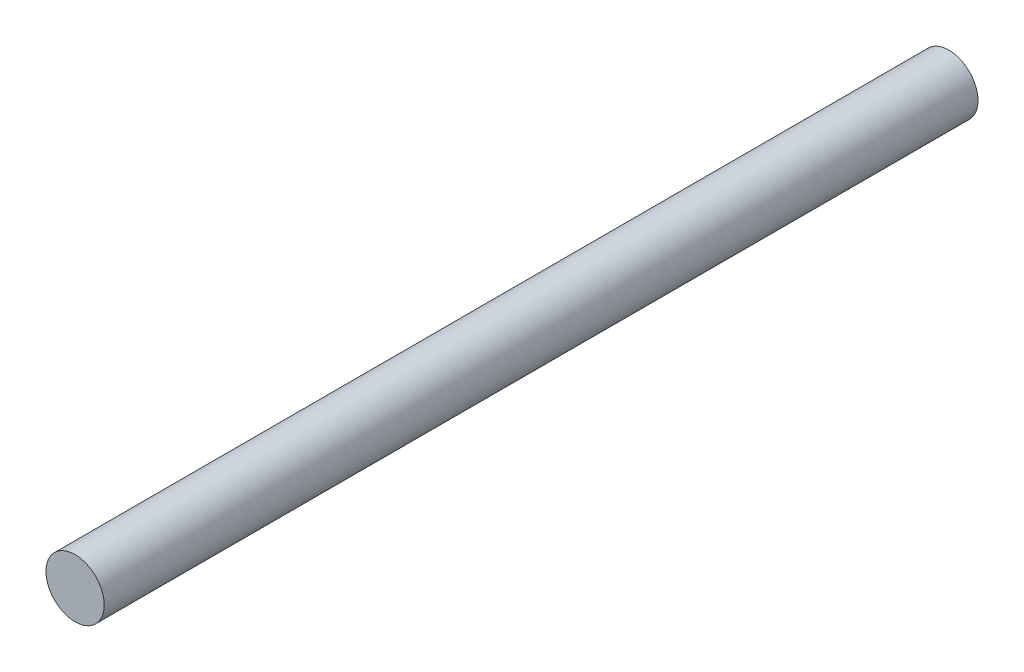
ISO-10303-21;
HEADER;
FILE_DESCRIPTION(('STEP AP214'),'2;1');
FILE_NAME('part.step','',(''),(''),'','','');
FILE_SCHEMA(('AUTOMOTIVE_DESIGN { 1 0 10303 214 1 1 1 1 }'));
ENDSEC;
DATA;
#1=APPLICATION_CONTEXT('core data for automotive mechanical design processes');
#2=APPLICATION_PROTOCOL_DEFINITION('international standard','automotive_design',2000,#1);
#3=PRODUCT_CONTEXT('',#1,'mechanical');
#4=PRODUCT('Part','Part','',(#3));
#5=PRODUCT_RELATED_PRODUCT_CATEGORY('part','',(#4));
#6=PRODUCT_DEFINITION_FORMATION('','',#4);
#7=PRODUCT_DEFINITION_CONTEXT('part definition',#1,'design');
#8=PRODUCT_DEFINITION('design','',#6,#7);
#9=PRODUCT_DEFINITION_SHAPE('','',#8);
#10=(LENGTH_UNIT() NAMED_UNIT(*) SI_UNIT(.MILLI.,.METRE.));
#11=(NAMED_UNIT(*) PLANE_ANGLE_UNIT() SI_UNIT($,.RADIAN.));
#12=(NAMED_UNIT(*) SI_UNIT($,.STERADIAN.) SOLID_ANGLE_UNIT());
#13=UNCERTAINTY_MEASURE_WITH_UNIT(LENGTH_MEASURE(1.E-05),#10,'distance_accuracy_value','');
#14=(GEOMETRIC_REPRESENTATION_CONTEXT(3) GLOBAL_UNCERTAINTY_ASSIGNED_CONTEXT((#13)) GLOBAL_UNIT_ASSIGNED_CONTEXT((#10,
#11,#12)) REPRESENTATION_CONTEXT('',''));
#15=CARTESIAN_POINT('',(0.,0.,0.));
#16=DIRECTION('',(0.,0.,1.));
#17=DIRECTION('',(1.,0.,0.));
#18=AXIS2_PLACEMENT_3D('',#15,#16,#17);
#19=CARTESIAN_POINT('',(0.,0.,150.));
#20=DIRECTION('',(0.,0.,-1.));
#21=DIRECTION('',(-1.,0.,0.));
#22=AXIS2_PLACEMENT_3D('',#19,#20,#21);
#23=CYLINDRICAL_SURFACE('',#22,5.);
#24=CARTESIAN_POINT('',(0.,0.,150.));
#25=DIRECTION('',(0.,0.,1.));
#26=DIRECTION('',(1.,0.,0.));
#27=AXIS2_PLACEMENT_3D('',#24,#25,#26);
#28=CIRCLE('',#27,5.);
#29=CARTESIAN_POINT('',(5.,0.,150.));
#30=VERTEX_POINT('',#29);
#31=EDGE_CURVE('E10',#30,#30,#28,.T.);
#32=ORIENTED_EDGE('',*,*,#31,.F.);
#33=EDGE_LOOP('',(#32));
#34=FACE_BOUND('',#33,.T.);
#35=CARTESIAN_POINT('',(0.,0.,0.));
#36=DIRECTION('',(0.,0.,1.));
#37=DIRECTION('',(1.,0.,0.));
#38=AXIS2_PLACEMENT_3D('',#35,#36,#37);
#39=CIRCLE('',#38,5.);
#40=CARTESIAN_POINT('',(5.,0.,0.));
#41=VERTEX_POINT('',#40);
#42=EDGE_CURVE('E40',#41,#41,#39,.T.);
#43=ORIENTED_EDGE('',*,*,#42,.T.);
#44=EDGE_LOOP('',(#43));
#45=FACE_BOUND('',#44,.T.);
#46=ADVANCED_FACE('F37',(#34,#45),#23,.T.);
#47=CARTESIAN_POINT('',(0.,0.,150.));
#48=DIRECTION('',(0.,0.,1.));
#49=DIRECTION('',(1.,0.,0.));
#50=AXIS2_PLACEMENT_3D('',#47,#48,#49);
#51=PLANE('',#50);
#52=ORIENTED_EDGE('',*,*,#31,.T.);
#53=EDGE_LOOP('',(#52));
#54=FACE_BOUND('',#53,.T.);
#55=ADVANCED_FACE('F54',(#54),#51,.T.);
#56=CARTESIAN_POINT('',(0.,0.,0.));
#57=DIRECTION('',(0.,0.,1.));
#58=DIRECTION('',(1.,0.,0.));
#59=AXIS2_PLACEMENT_3D('',#56,#57,#58);
#60=PLANE('',#59);
#61=ORIENTED_EDGE('',*,*,#42,.F.);
#62=EDGE_LOOP('',(#61));
#63=FACE_BOUND('',#62,.T.);
#64=ADVANCED_FACE('F52',(#63),#60,.F.);
#65=CLOSED_SHELL('',(#46,#55,#64));
#66=MANIFOLD_SOLID_BREP('B2',#65);
#67=ADVANCED_BREP_SHAPE_REPRESENTATION('',(#18,#66),#14);
#68=SHAPE_DEFINITION_REPRESENTATION(#9,#67);
ENDSEC;
END-ISO-10303-21;
